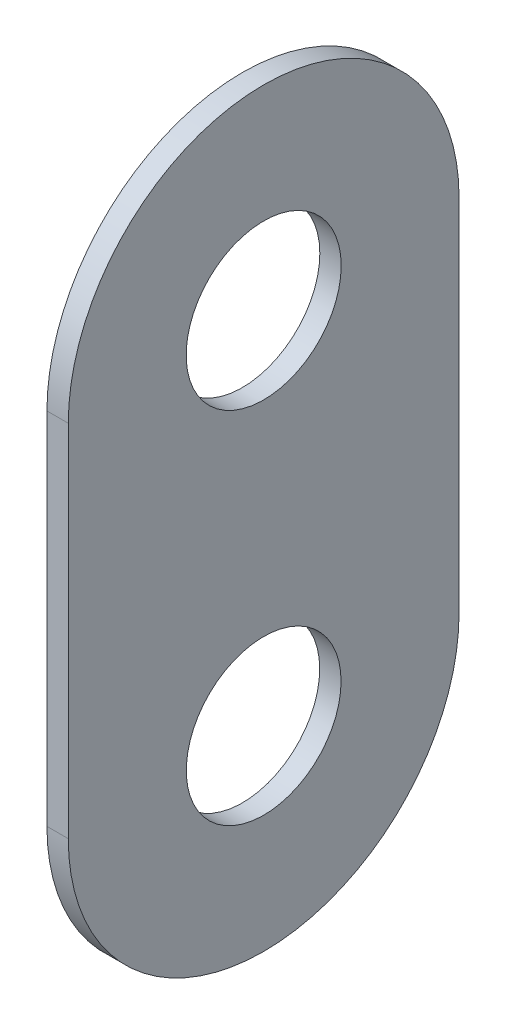
ISO-10303-21;
HEADER;
FILE_DESCRIPTION(('STEP AP214'),'2;1');
FILE_NAME('part.step','',(''),(''),'','','');
FILE_SCHEMA(('AUTOMOTIVE_DESIGN { 1 0 10303 214 1 1 1 1 }'));
ENDSEC;
DATA;
#1=APPLICATION_CONTEXT('core data for automotive mechanical design processes');
#2=APPLICATION_PROTOCOL_DEFINITION('international standard','automotive_design',2000,#1);
#3=PRODUCT_CONTEXT('',#1,'mechanical');
#4=PRODUCT('Part','Part','',(#3));
#5=PRODUCT_RELATED_PRODUCT_CATEGORY('part','',(#4));
#6=PRODUCT_DEFINITION_FORMATION('','',#4);
#7=PRODUCT_DEFINITION_CONTEXT('part definition',#1,'design');
#8=PRODUCT_DEFINITION('design','',#6,#7);
#9=PRODUCT_DEFINITION_SHAPE('','',#8);
#10=(LENGTH_UNIT() NAMED_UNIT(*) SI_UNIT(.MILLI.,.METRE.));
#11=(NAMED_UNIT(*) PLANE_ANGLE_UNIT() SI_UNIT($,.RADIAN.));
#12=(NAMED_UNIT(*) SI_UNIT($,.STERADIAN.) SOLID_ANGLE_UNIT());
#13=UNCERTAINTY_MEASURE_WITH_UNIT(LENGTH_MEASURE(1.E-05),#10,'distance_accuracy_value','');
#14=(GEOMETRIC_REPRESENTATION_CONTEXT(3) GLOBAL_UNCERTAINTY_ASSIGNED_CONTEXT((#13)) GLOBAL_UNIT_ASSIGNED_CONTEXT((#10,
#11,#12)) REPRESENTATION_CONTEXT('',''));
#15=CARTESIAN_POINT('',(0.,0.,0.));
#16=DIRECTION('',(0.,0.,1.));
#17=DIRECTION('',(1.,0.,0.));
#18=AXIS2_PLACEMENT_3D('',#15,#16,#17);
#19=CARTESIAN_POINT('',(10.,82.3691,0.));
#20=DIRECTION('',(1.,0.,0.));
#21=DIRECTION('',(0.,0.,-1.));
#22=AXIS2_PLACEMENT_3D('',#19,#20,#21);
#23=PLANE('',#22);
#24=CARTESIAN_POINT('',(10.,82.3691,0.));
#25=DIRECTION('',(1.,0.,0.));
#26=DIRECTION('',(0.,0.,-1.));
#27=AXIS2_PLACEMENT_3D('',#24,#25,#26);
#28=CIRCLE('',#27,36.3);
#29=CARTESIAN_POINT('',(10.,82.3691,-36.3));
#30=VERTEX_POINT('',#29);
#31=EDGE_CURVE('E100',#30,#30,#28,.T.);
#32=ORIENTED_EDGE('',*,*,#31,.F.);
#33=EDGE_LOOP('',(#32));
#34=FACE_BOUND('',#33,.T.);
#35=CARTESIAN_POINT('',(10.,82.3691,0.));
#36=DIRECTION('',(1.,0.,0.));
#37=DIRECTION('',(0.,0.,-1.));
#38=AXIS2_PLACEMENT_3D('',#35,#36,#37);
#39=CIRCLE('',#38,91.5);
#40=CARTESIAN_POINT('',(10.,82.3691,-91.5));
#41=VERTEX_POINT('',#40);
#42=CARTESIAN_POINT('',(10.,82.3691,91.5));
#43=VERTEX_POINT('',#42);
#44=EDGE_CURVE('E85',#41,#43,#39,.T.);
#45=ORIENTED_EDGE('',*,*,#44,.T.);
#46=DIRECTION('',(0.,-1.,0.));
#47=VECTOR('',#46,1.);
#48=CARTESIAN_POINT('',(10.,82.3691,91.5));
#49=LINE('',#48,#47);
#50=CARTESIAN_POINT('',(10.,-86.11315,91.5));
#51=VERTEX_POINT('',#50);
#52=EDGE_CURVE('E80',#43,#51,#49,.T.);
#53=ORIENTED_EDGE('',*,*,#52,.T.);
#54=CARTESIAN_POINT('',(10.,-86.11315,0.));
#55=DIRECTION('',(1.,0.,0.));
#56=DIRECTION('',(0.,0.,-1.));
#57=AXIS2_PLACEMENT_3D('',#54,#55,#56);
#58=CIRCLE('',#57,91.5);
#59=CARTESIAN_POINT('',(10.,-86.11315,-91.5));
#60=VERTEX_POINT('',#59);
#61=EDGE_CURVE('E83',#51,#60,#58,.T.);
#62=ORIENTED_EDGE('',*,*,#61,.T.);
#63=DIRECTION('',(0.,1.,0.));
#64=VECTOR('',#63,1.);
#65=CARTESIAN_POINT('',(10.,82.3691,-91.5));
#66=LINE('',#65,#64);
#67=EDGE_CURVE('E50',#60,#41,#66,.T.);
#68=ORIENTED_EDGE('',*,*,#67,.T.);
#69=EDGE_LOOP('',(#45,#53,#62,#68));
#70=FACE_BOUND('',#69,.T.);
#71=CARTESIAN_POINT('',(10.,-86.11315,0.));
#72=DIRECTION('',(1.,0.,0.));
#73=DIRECTION('',(0.,0.,-1.));
#74=AXIS2_PLACEMENT_3D('',#71,#72,#73);
#75=CIRCLE('',#74,36.241875);
#76=CARTESIAN_POINT('',(10.,-86.11315,-36.241875));
#77=VERTEX_POINT('',#76);
#78=EDGE_CURVE('E115',#77,#77,#75,.T.);
#79=ORIENTED_EDGE('',*,*,#78,.F.);
#80=EDGE_LOOP('',(#79));
#81=FACE_BOUND('',#80,.T.);
#82=ADVANCED_FACE('F33',(#34,#70,#81),#23,.T.);
#83=CARTESIAN_POINT('',(0.,82.3691,0.));
#84=DIRECTION('',(1.,0.,0.));
#85=DIRECTION('',(0.,0.,-1.));
#86=AXIS2_PLACEMENT_3D('',#83,#84,#85);
#87=PLANE('',#86);
#88=CARTESIAN_POINT('',(0.,82.3691,0.));
#89=DIRECTION('',(1.,0.,0.));
#90=DIRECTION('',(0.,0.,-1.));
#91=AXIS2_PLACEMENT_3D('',#88,#89,#90);
#92=CIRCLE('',#91,91.5);
#93=CARTESIAN_POINT('',(0.,82.3691,-91.5));
#94=VERTEX_POINT('',#93);
#95=CARTESIAN_POINT('',(0.,82.3691,91.5));
#96=VERTEX_POINT('',#95);
#97=EDGE_CURVE('E97',#94,#96,#92,.T.);
#98=ORIENTED_EDGE('',*,*,#97,.F.);
#99=DIRECTION('',(0.,1.,0.));
#100=VECTOR('',#99,1.);
#101=CARTESIAN_POINT('',(0.,82.3691,-91.5));
#102=LINE('',#101,#100);
#103=CARTESIAN_POINT('',(0.,-86.11315,-91.5));
#104=VERTEX_POINT('',#103);
#105=EDGE_CURVE('E73',#104,#94,#102,.T.);
#106=ORIENTED_EDGE('',*,*,#105,.F.);
#107=CARTESIAN_POINT('',(0.,-86.11315,0.));
#108=DIRECTION('',(1.,0.,0.));
#109=DIRECTION('',(0.,0.,-1.));
#110=AXIS2_PLACEMENT_3D('',#107,#108,#109);
#111=CIRCLE('',#110,91.5);
#112=CARTESIAN_POINT('',(0.,-86.11315,91.5));
#113=VERTEX_POINT('',#112);
#114=EDGE_CURVE('E67',#113,#104,#111,.T.);
#115=ORIENTED_EDGE('',*,*,#114,.F.);
#116=DIRECTION('',(0.,-1.,0.));
#117=VECTOR('',#116,1.);
#118=CARTESIAN_POINT('',(0.,82.3691,91.5));
#119=LINE('',#118,#117);
#120=EDGE_CURVE('E89',#96,#113,#119,.T.);
#121=ORIENTED_EDGE('',*,*,#120,.F.);
#122=EDGE_LOOP('',(#98,#106,#115,#121));
#123=FACE_BOUND('',#122,.T.);
#124=CARTESIAN_POINT('',(0.,82.3691,0.));
#125=DIRECTION('',(1.,0.,0.));
#126=DIRECTION('',(0.,0.,-1.));
#127=AXIS2_PLACEMENT_3D('',#124,#125,#126);
#128=CIRCLE('',#127,36.3);
#129=CARTESIAN_POINT('',(0.,82.3691,-36.3));
#130=VERTEX_POINT('',#129);
#131=EDGE_CURVE('E112',#130,#130,#128,.T.);
#132=ORIENTED_EDGE('',*,*,#131,.T.);
#133=EDGE_LOOP('',(#132));
#134=FACE_BOUND('',#133,.T.);
#135=CARTESIAN_POINT('',(0.,-86.11315,0.));
#136=DIRECTION('',(1.,0.,0.));
#137=DIRECTION('',(0.,0.,-1.));
#138=AXIS2_PLACEMENT_3D('',#135,#136,#137);
#139=CIRCLE('',#138,36.241875);
#140=CARTESIAN_POINT('',(0.,-86.11315,-36.241875));
#141=VERTEX_POINT('',#140);
#142=EDGE_CURVE('E118',#141,#141,#139,.T.);
#143=ORIENTED_EDGE('',*,*,#142,.T.);
#144=EDGE_LOOP('',(#143));
#145=FACE_BOUND('',#144,.T.);
#146=ADVANCED_FACE('F108',(#123,#134,#145),#87,.F.);
#147=CARTESIAN_POINT('',(10.,82.3691,0.));
#148=DIRECTION('',(-1.,0.,0.));
#149=DIRECTION('',(0.,0.,1.));
#150=AXIS2_PLACEMENT_3D('',#147,#148,#149);
#151=CYLINDRICAL_SURFACE('',#150,91.5);
#152=ORIENTED_EDGE('',*,*,#97,.T.);
#153=DIRECTION('',(-1.,0.,0.));
#154=VECTOR('',#153,1.);
#155=CARTESIAN_POINT('',(10.,82.3691,91.5));
#156=LINE('',#155,#154);
#157=EDGE_CURVE('E11',#43,#96,#156,.T.);
#158=ORIENTED_EDGE('',*,*,#157,.F.);
#159=ORIENTED_EDGE('',*,*,#44,.F.);
#160=DIRECTION('',(-1.,0.,0.));
#161=VECTOR('',#160,1.);
#162=CARTESIAN_POINT('',(10.,82.3691,-91.5));
#163=LINE('',#162,#161);
#164=EDGE_CURVE('E93',#41,#94,#163,.T.);
#165=ORIENTED_EDGE('',*,*,#164,.T.);
#166=EDGE_LOOP('',(#152,#158,#159,#165));
#167=FACE_BOUND('',#166,.T.);
#168=ADVANCED_FACE('F35',(#167),#151,.T.);
#169=CARTESIAN_POINT('',(10.,82.3691,91.5));
#170=DIRECTION('',(0.,0.,-1.));
#171=DIRECTION('',(0.,1.,0.));
#172=AXIS2_PLACEMENT_3D('',#169,#170,#171);
#173=PLANE('',#172);
#174=ORIENTED_EDGE('',*,*,#120,.T.);
#175=DIRECTION('',(-1.,0.,0.));
#176=VECTOR('',#175,1.);
#177=CARTESIAN_POINT('',(10.,-86.11315,91.5));
#178=LINE('',#177,#176);
#179=EDGE_CURVE('E42',#51,#113,#178,.T.);
#180=ORIENTED_EDGE('',*,*,#179,.F.);
#181=ORIENTED_EDGE('',*,*,#52,.F.);
#182=ORIENTED_EDGE('',*,*,#157,.T.);
#183=EDGE_LOOP('',(#174,#180,#181,#182));
#184=FACE_BOUND('',#183,.T.);
#185=ADVANCED_FACE('F88',(#184),#173,.F.);
#186=CARTESIAN_POINT('',(10.,-86.11315,0.));
#187=DIRECTION('',(-1.,0.,0.));
#188=DIRECTION('',(0.,0.,1.));
#189=AXIS2_PLACEMENT_3D('',#186,#187,#188);
#190=CYLINDRICAL_SURFACE('',#189,91.5);
#191=ORIENTED_EDGE('',*,*,#114,.T.);
#192=DIRECTION('',(-1.,0.,0.));
#193=VECTOR('',#192,1.);
#194=CARTESIAN_POINT('',(10.,-86.11315,-91.5));
#195=LINE('',#194,#193);
#196=EDGE_CURVE('E90',#60,#104,#195,.T.);
#197=ORIENTED_EDGE('',*,*,#196,.F.);
#198=ORIENTED_EDGE('',*,*,#61,.F.);
#199=ORIENTED_EDGE('',*,*,#179,.T.);
#200=EDGE_LOOP('',(#191,#197,#198,#199));
#201=FACE_BOUND('',#200,.T.);
#202=ADVANCED_FACE('F91',(#201),#190,.T.);
#203=CARTESIAN_POINT('',(10.,82.3691,-91.5));
#204=DIRECTION('',(0.,0.,1.));
#205=DIRECTION('',(1.,0.,0.));
#206=AXIS2_PLACEMENT_3D('',#203,#204,#205);
#207=PLANE('',#206);
#208=ORIENTED_EDGE('',*,*,#105,.T.);
#209=ORIENTED_EDGE('',*,*,#164,.F.);
#210=ORIENTED_EDGE('',*,*,#67,.F.);
#211=ORIENTED_EDGE('',*,*,#196,.T.);
#212=EDGE_LOOP('',(#208,#209,#210,#211));
#213=FACE_BOUND('',#212,.T.);
#214=ADVANCED_FACE('F105',(#213),#207,.F.);
#215=CARTESIAN_POINT('',(10.,82.3691,0.));
#216=DIRECTION('',(-1.,0.,0.));
#217=DIRECTION('',(0.,0.,1.));
#218=AXIS2_PLACEMENT_3D('',#215,#216,#217);
#219=CYLINDRICAL_SURFACE('',#218,36.3);
#220=ORIENTED_EDGE('',*,*,#31,.T.);
#221=EDGE_LOOP('',(#220));
#222=FACE_BOUND('',#221,.T.);
#223=ORIENTED_EDGE('',*,*,#131,.F.);
#224=EDGE_LOOP('',(#223));
#225=FACE_BOUND('',#224,.T.);
#226=ADVANCED_FACE('F135',(#222,#225),#219,.F.);
#227=CARTESIAN_POINT('',(10.,-86.11315,0.));
#228=DIRECTION('',(-1.,0.,0.));
#229=DIRECTION('',(0.,0.,1.));
#230=AXIS2_PLACEMENT_3D('',#227,#228,#229);
#231=CYLINDRICAL_SURFACE('',#230,36.241875);
#232=ORIENTED_EDGE('',*,*,#78,.T.);
#233=EDGE_LOOP('',(#232));
#234=FACE_BOUND('',#233,.T.);
#235=ORIENTED_EDGE('',*,*,#142,.F.);
#236=EDGE_LOOP('',(#235));
#237=FACE_BOUND('',#236,.T.);
#238=ADVANCED_FACE('F124',(#234,#237),#231,.F.);
#239=CLOSED_SHELL('',(#82,#146,#168,#185,#202,#214,#226,#238));
#240=MANIFOLD_SOLID_BREP('B2',#239);
#241=ADVANCED_BREP_SHAPE_REPRESENTATION('',(#18,#240),#14);
#242=SHAPE_DEFINITION_REPRESENTATION(#9,#241);
ENDSEC;
END-ISO-10303-21;
